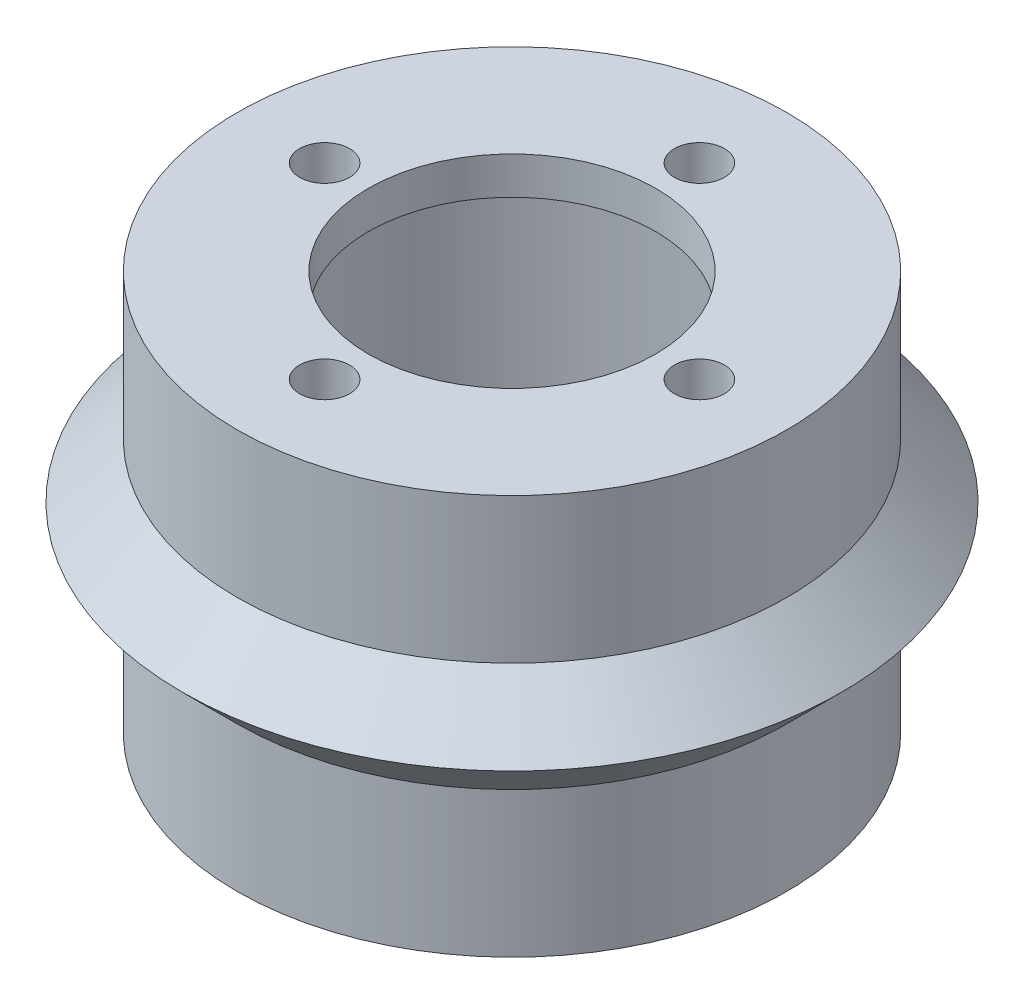
ISO-10303-21;
HEADER;
FILE_DESCRIPTION(('STEP AP214'),'2;1');
FILE_NAME('part.step','',(''),(''),'','','');
FILE_SCHEMA(('AUTOMOTIVE_DESIGN { 1 0 10303 214 1 1 1 1 }'));
ENDSEC;
DATA;
#1=APPLICATION_CONTEXT('core data for automotive mechanical design processes');
#2=APPLICATION_PROTOCOL_DEFINITION('international standard','automotive_design',2000,#1);
#3=PRODUCT_CONTEXT('',#1,'mechanical');
#4=PRODUCT('Part','Part','',(#3));
#5=PRODUCT_RELATED_PRODUCT_CATEGORY('part','',(#4));
#6=PRODUCT_DEFINITION_FORMATION('','',#4);
#7=PRODUCT_DEFINITION_CONTEXT('part definition',#1,'design');
#8=PRODUCT_DEFINITION('design','',#6,#7);
#9=PRODUCT_DEFINITION_SHAPE('','',#8);
#10=(LENGTH_UNIT() NAMED_UNIT(*) SI_UNIT(.MILLI.,.METRE.));
#11=(NAMED_UNIT(*) PLANE_ANGLE_UNIT() SI_UNIT($,.RADIAN.));
#12=(NAMED_UNIT(*) SI_UNIT($,.STERADIAN.) SOLID_ANGLE_UNIT());
#13=UNCERTAINTY_MEASURE_WITH_UNIT(LENGTH_MEASURE(1.E-05),#10,'distance_accuracy_value','');
#14=(GEOMETRIC_REPRESENTATION_CONTEXT(3) GLOBAL_UNCERTAINTY_ASSIGNED_CONTEXT((#13)) GLOBAL_UNIT_ASSIGNED_CONTEXT((#10,
#11,#12)) REPRESENTATION_CONTEXT('',''));
#15=CARTESIAN_POINT('',(0.,0.,0.));
#16=DIRECTION('',(0.,0.,1.));
#17=DIRECTION('',(1.,0.,0.));
#18=AXIS2_PLACEMENT_3D('',#15,#16,#17);
#19=CARTESIAN_POINT('',(0.,-4.37867965644037,0.));
#20=DIRECTION('',(0.,1.,0.));
#21=DIRECTION('',(0.,0.,1.));
#22=AXIS2_PLACEMENT_3D('',#19,#20,#21);
#23=CONICAL_SURFACE('',#22,22.,0.785398163397441);
#24=CARTESIAN_POINT('',(0.,0.,0.));
#25=DIRECTION('',(0.,-1.,0.));
#26=DIRECTION('',(0.,0.,-1.));
#27=AXIS2_PLACEMENT_3D('',#24,#25,#26);
#28=CIRCLE('',#27,26.3786796564404);
#29=CARTESIAN_POINT('',(0.,0.,-26.3786796564404));
#30=VERTEX_POINT('',#29);
#31=EDGE_CURVE('E68',#30,#30,#28,.T.);
#32=ORIENTED_EDGE('',*,*,#31,.T.);
#33=EDGE_LOOP('',(#32));
#34=FACE_BOUND('',#33,.T.);
#35=CARTESIAN_POINT('',(0.,-4.37867965644037,0.));
#36=DIRECTION('',(0.,-1.,0.));
#37=DIRECTION('',(0.,0.,-1.));
#38=AXIS2_PLACEMENT_3D('',#35,#36,#37);
#39=CIRCLE('',#38,22.);
#40=CARTESIAN_POINT('',(0.,-4.37867965644037,-22.));
#41=VERTEX_POINT('',#40);
#42=EDGE_CURVE('E44',#41,#41,#39,.T.);
#43=ORIENTED_EDGE('',*,*,#42,.F.);
#44=EDGE_LOOP('',(#43));
#45=FACE_BOUND('',#44,.T.);
#46=ADVANCED_FACE('F37',(#34,#45),#23,.T.);
#47=CARTESIAN_POINT('',(0.,0.,0.));
#48=DIRECTION('',(0.,-1.,0.));
#49=DIRECTION('',(0.,0.,-1.));
#50=AXIS2_PLACEMENT_3D('',#47,#48,#49);
#51=CYLINDRICAL_SURFACE('',#50,22.);
#52=ORIENTED_EDGE('',*,*,#42,.T.);
#53=EDGE_LOOP('',(#52));
#54=FACE_BOUND('',#53,.T.);
#55=CARTESIAN_POINT('',(0.,-16.,0.));
#56=DIRECTION('',(0.,-1.,0.));
#57=DIRECTION('',(0.,0.,-1.));
#58=AXIS2_PLACEMENT_3D('',#55,#56,#57);
#59=CIRCLE('',#58,22.);
#60=CARTESIAN_POINT('',(0.,-16.,-22.));
#61=VERTEX_POINT('',#60);
#62=EDGE_CURVE('E49',#61,#61,#59,.T.);
#63=ORIENTED_EDGE('',*,*,#62,.F.);
#64=EDGE_LOOP('',(#63));
#65=FACE_BOUND('',#64,.T.);
#66=ADVANCED_FACE('F135',(#54,#65),#51,.T.);
#67=CARTESIAN_POINT('',(22.,-16.,0.));
#68=DIRECTION('',(0.,-1.,0.));
#69=DIRECTION('',(0.,0.,-1.));
#70=AXIS2_PLACEMENT_3D('',#67,#68,#69);
#71=PLANE('',#70);
#72=ORIENTED_EDGE('',*,*,#62,.T.);
#73=EDGE_LOOP('',(#72));
#74=FACE_BOUND('',#73,.T.);
#75=CARTESIAN_POINT('',(0.,-16.,0.));
#76=DIRECTION('',(0.,-1.,0.));
#77=DIRECTION('',(0.,0.,-1.));
#78=AXIS2_PLACEMENT_3D('',#75,#76,#77);
#79=CIRCLE('',#78,18.5);
#80=CARTESIAN_POINT('',(0.,-16.,-18.5));
#81=VERTEX_POINT('',#80);
#82=EDGE_CURVE('E54',#81,#81,#79,.T.);
#83=ORIENTED_EDGE('',*,*,#82,.F.);
#84=EDGE_LOOP('',(#83));
#85=FACE_BOUND('',#84,.T.);
#86=ADVANCED_FACE('F140',(#74,#85),#71,.T.);
#87=CARTESIAN_POINT('',(0.,0.,0.));
#88=DIRECTION('',(0.,-1.,0.));
#89=DIRECTION('',(0.,0.,-1.));
#90=AXIS2_PLACEMENT_3D('',#87,#88,#89);
#91=CYLINDRICAL_SURFACE('',#90,18.5);
#92=CARTESIAN_POINT('',(0.,13.,0.));
#93=DIRECTION('',(0.,-1.,0.));
#94=DIRECTION('',(0.,0.,-1.));
#95=AXIS2_PLACEMENT_3D('',#92,#93,#94);
#96=CIRCLE('',#95,18.5);
#97=CARTESIAN_POINT('',(0.,13.,-18.5));
#98=VERTEX_POINT('',#97);
#99=EDGE_CURVE('E10',#98,#98,#96,.T.);
#100=ORIENTED_EDGE('',*,*,#99,.F.);
#101=EDGE_LOOP('',(#100));
#102=FACE_BOUND('',#101,.T.);
#103=ORIENTED_EDGE('',*,*,#82,.T.);
#104=EDGE_LOOP('',(#103));
#105=FACE_BOUND('',#104,.T.);
#106=ADVANCED_FACE('F147',(#102,#105),#91,.F.);
#107=CARTESIAN_POINT('',(22.,16.,0.));
#108=DIRECTION('',(0.,1.,0.));
#109=DIRECTION('',(0.,0.,1.));
#110=AXIS2_PLACEMENT_3D('',#107,#108,#109);
#111=PLANE('',#110);
#112=CARTESIAN_POINT('',(0.,16.,0.));
#113=DIRECTION('',(0.,-1.,0.));
#114=DIRECTION('',(0.,0.,-1.));
#115=AXIS2_PLACEMENT_3D('',#112,#113,#114);
#116=CIRCLE('',#115,22.);
#117=CARTESIAN_POINT('',(0.,16.,-22.));
#118=VERTEX_POINT('',#117);
#119=EDGE_CURVE('E60',#118,#118,#116,.T.);
#120=ORIENTED_EDGE('',*,*,#119,.F.);
#121=EDGE_LOOP('',(#120));
#122=FACE_BOUND('',#121,.T.);
#123=CARTESIAN_POINT('',(15.,16.,0.));
#124=DIRECTION('',(0.,-1.,0.));
#125=DIRECTION('',(0.,0.,-1.));
#126=AXIS2_PLACEMENT_3D('',#123,#124,#125);
#127=CIRCLE('',#126,2.);
#128=CARTESIAN_POINT('',(15.,16.,-2.));
#129=VERTEX_POINT('',#128);
#130=EDGE_CURVE('E73',#129,#129,#127,.T.);
#131=ORIENTED_EDGE('',*,*,#130,.T.);
#132=EDGE_LOOP('',(#131));
#133=FACE_BOUND('',#132,.T.);
#134=CARTESIAN_POINT('',(0.,16.,0.));
#135=DIRECTION('',(0.,-1.,0.));
#136=DIRECTION('',(0.,0.,-1.));
#137=AXIS2_PLACEMENT_3D('',#134,#135,#136);
#138=CIRCLE('',#137,11.4969351916493);
#139=CARTESIAN_POINT('',(0.,16.,-11.4969351916493));
#140=VERTEX_POINT('',#139);
#141=EDGE_CURVE('E81',#140,#140,#138,.T.);
#142=ORIENTED_EDGE('',*,*,#141,.T.);
#143=EDGE_LOOP('',(#142));
#144=FACE_BOUND('',#143,.T.);
#145=CARTESIAN_POINT('',(0.,16.,-15.));
#146=DIRECTION('',(0.,-1.,0.));
#147=DIRECTION('',(0.,0.,-1.));
#148=AXIS2_PLACEMENT_3D('',#145,#146,#147);
#149=CIRCLE('',#148,2.);
#150=CARTESIAN_POINT('',(0.,16.,-17.));
#151=VERTEX_POINT('',#150);
#152=EDGE_CURVE('E89',#151,#151,#149,.T.);
#153=ORIENTED_EDGE('',*,*,#152,.T.);
#154=EDGE_LOOP('',(#153));
#155=FACE_BOUND('',#154,.T.);
#156=CARTESIAN_POINT('',(-15.,16.,1.04744440165294E-13));
#157=DIRECTION('',(0.,-1.,0.));
#158=DIRECTION('',(0.,0.,-1.));
#159=AXIS2_PLACEMENT_3D('',#156,#157,#158);
#160=CIRCLE('',#159,2.);
#161=CARTESIAN_POINT('',(-15.,16.,-1.99999999999989));
#162=VERTEX_POINT('',#161);
#163=EDGE_CURVE('E97',#162,#162,#160,.T.);
#164=ORIENTED_EDGE('',*,*,#163,.T.);
#165=EDGE_LOOP('',(#164));
#166=FACE_BOUND('',#165,.T.);
#167=CARTESIAN_POINT('',(1.57116660247941E-13,16.,15.));
#168=DIRECTION('',(0.,-1.,0.));
#169=DIRECTION('',(0.,0.,-1.));
#170=AXIS2_PLACEMENT_3D('',#167,#168,#169);
#171=CIRCLE('',#170,2.);
#172=CARTESIAN_POINT('',(1.57116660247941E-13,16.,13.));
#173=VERTEX_POINT('',#172);
#174=EDGE_CURVE('E105',#173,#173,#171,.T.);
#175=ORIENTED_EDGE('',*,*,#174,.T.);
#176=EDGE_LOOP('',(#175));
#177=FACE_BOUND('',#176,.T.);
#178=ADVANCED_FACE('F154',(#122,#133,#144,#155,#166,#177),#111,.T.);
#179=CARTESIAN_POINT('',(0.,0.,0.));
#180=DIRECTION('',(0.,-1.,0.));
#181=DIRECTION('',(0.,0.,-1.));
#182=AXIS2_PLACEMENT_3D('',#179,#180,#181);
#183=CYLINDRICAL_SURFACE('',#182,22.);
#184=ORIENTED_EDGE('',*,*,#119,.T.);
#185=EDGE_LOOP('',(#184));
#186=FACE_BOUND('',#185,.T.);
#187=CARTESIAN_POINT('',(0.,4.37867965644037,0.));
#188=DIRECTION('',(0.,-1.,0.));
#189=DIRECTION('',(0.,0.,-1.));
#190=AXIS2_PLACEMENT_3D('',#187,#188,#189);
#191=CIRCLE('',#190,22.);
#192=CARTESIAN_POINT('',(0.,4.37867965644037,-22.));
#193=VERTEX_POINT('',#192);
#194=EDGE_CURVE('E64',#193,#193,#191,.T.);
#195=ORIENTED_EDGE('',*,*,#194,.F.);
#196=EDGE_LOOP('',(#195));
#197=FACE_BOUND('',#196,.T.);
#198=ADVANCED_FACE('F129',(#186,#197),#183,.T.);
#199=CARTESIAN_POINT('',(0.,0.,0.));
#200=DIRECTION('',(0.,-1.,0.));
#201=DIRECTION('',(0.,0.,-1.));
#202=AXIS2_PLACEMENT_3D('',#199,#200,#201);
#203=CONICAL_SURFACE('',#202,26.3786796564404,0.78539816339745);
#204=ORIENTED_EDGE('',*,*,#194,.T.);
#205=EDGE_LOOP('',(#204));
#206=FACE_BOUND('',#205,.T.);
#207=ORIENTED_EDGE('',*,*,#31,.F.);
#208=EDGE_LOOP('',(#207));
#209=FACE_BOUND('',#208,.T.);
#210=ADVANCED_FACE('F119',(#206,#209),#203,.T.);
#211=CARTESIAN_POINT('',(0.,13.,0.));
#212=DIRECTION('',(0.,-1.,0.));
#213=DIRECTION('',(0.,0.,-1.));
#214=AXIS2_PLACEMENT_3D('',#211,#212,#213);
#215=PLANE('',#214);
#216=CARTESIAN_POINT('',(-15.,13.,1.04744440165294E-13));
#217=DIRECTION('',(0.,-1.,0.));
#218=DIRECTION('',(0.,0.,-1.));
#219=AXIS2_PLACEMENT_3D('',#216,#217,#218);
#220=CIRCLE('',#219,2.);
#221=CARTESIAN_POINT('',(-15.,13.,-1.99999999999989));
#222=VERTEX_POINT('',#221);
#223=EDGE_CURVE('E93',#222,#222,#220,.T.);
#224=ORIENTED_EDGE('',*,*,#223,.F.);
#225=EDGE_LOOP('',(#224));
#226=FACE_BOUND('',#225,.T.);
#227=CARTESIAN_POINT('',(0.,13.,0.));
#228=DIRECTION('',(0.,-1.,0.));
#229=DIRECTION('',(0.,0.,-1.));
#230=AXIS2_PLACEMENT_3D('',#227,#228,#229);
#231=CIRCLE('',#230,11.4969351916493);
#232=CARTESIAN_POINT('',(0.,13.,-11.4969351916493));
#233=VERTEX_POINT('',#232);
#234=EDGE_CURVE('E77',#233,#233,#231,.T.);
#235=ORIENTED_EDGE('',*,*,#234,.F.);
#236=EDGE_LOOP('',(#235));
#237=FACE_BOUND('',#236,.T.);
#238=ORIENTED_EDGE('',*,*,#99,.T.);
#239=EDGE_LOOP('',(#238));
#240=FACE_BOUND('',#239,.T.);
#241=CARTESIAN_POINT('',(15.,13.,0.));
#242=DIRECTION('',(0.,-1.,0.));
#243=DIRECTION('',(0.,0.,-1.));
#244=AXIS2_PLACEMENT_3D('',#241,#242,#243);
#245=CIRCLE('',#244,2.);
#246=CARTESIAN_POINT('',(15.,13.,-2.));
#247=VERTEX_POINT('',#246);
#248=EDGE_CURVE('E72',#247,#247,#245,.T.);
#249=ORIENTED_EDGE('',*,*,#248,.F.);
#250=EDGE_LOOP('',(#249));
#251=FACE_BOUND('',#250,.T.);
#252=CARTESIAN_POINT('',(0.,13.,-15.));
#253=DIRECTION('',(0.,-1.,0.));
#254=DIRECTION('',(0.,0.,-1.));
#255=AXIS2_PLACEMENT_3D('',#252,#253,#254);
#256=CIRCLE('',#255,2.);
#257=CARTESIAN_POINT('',(0.,13.,-17.));
#258=VERTEX_POINT('',#257);
#259=EDGE_CURVE('E85',#258,#258,#256,.T.);
#260=ORIENTED_EDGE('',*,*,#259,.F.);
#261=EDGE_LOOP('',(#260));
#262=FACE_BOUND('',#261,.T.);
#263=CARTESIAN_POINT('',(1.57116660247941E-13,13.,15.));
#264=DIRECTION('',(0.,-1.,0.));
#265=DIRECTION('',(0.,0.,-1.));
#266=AXIS2_PLACEMENT_3D('',#263,#264,#265);
#267=CIRCLE('',#266,2.);
#268=CARTESIAN_POINT('',(1.57116660247941E-13,13.,13.));
#269=VERTEX_POINT('',#268);
#270=EDGE_CURVE('E101',#269,#269,#267,.T.);
#271=ORIENTED_EDGE('',*,*,#270,.F.);
#272=EDGE_LOOP('',(#271));
#273=FACE_BOUND('',#272,.T.);
#274=ADVANCED_FACE('F116',(#226,#237,#240,#251,#262,#273),#215,.T.);
#275=CARTESIAN_POINT('',(15.,13.,0.));
#276=DIRECTION('',(0.,1.,0.));
#277=DIRECTION('',(0.,0.,1.));
#278=AXIS2_PLACEMENT_3D('',#275,#276,#277);
#279=CYLINDRICAL_SURFACE('',#278,2.);
#280=ORIENTED_EDGE('',*,*,#248,.T.);
#281=EDGE_LOOP('',(#280));
#282=FACE_BOUND('',#281,.T.);
#283=ORIENTED_EDGE('',*,*,#130,.F.);
#284=EDGE_LOOP('',(#283));
#285=FACE_BOUND('',#284,.T.);
#286=ADVANCED_FACE('F118',(#282,#285),#279,.F.);
#287=CARTESIAN_POINT('',(0.,13.,0.));
#288=DIRECTION('',(0.,1.,0.));
#289=DIRECTION('',(0.,0.,1.));
#290=AXIS2_PLACEMENT_3D('',#287,#288,#289);
#291=CYLINDRICAL_SURFACE('',#290,11.4969351916493);
#292=ORIENTED_EDGE('',*,*,#234,.T.);
#293=EDGE_LOOP('',(#292));
#294=FACE_BOUND('',#293,.T.);
#295=ORIENTED_EDGE('',*,*,#141,.F.);
#296=EDGE_LOOP('',(#295));
#297=FACE_BOUND('',#296,.T.);
#298=ADVANCED_FACE('F126',(#294,#297),#291,.F.);
#299=CARTESIAN_POINT('',(0.,13.,-15.));
#300=DIRECTION('',(0.,1.,0.));
#301=DIRECTION('',(0.,0.,1.));
#302=AXIS2_PLACEMENT_3D('',#299,#300,#301);
#303=CYLINDRICAL_SURFACE('',#302,2.);
#304=ORIENTED_EDGE('',*,*,#259,.T.);
#305=EDGE_LOOP('',(#304));
#306=FACE_BOUND('',#305,.T.);
#307=ORIENTED_EDGE('',*,*,#152,.F.);
#308=EDGE_LOOP('',(#307));
#309=FACE_BOUND('',#308,.T.);
#310=ADVANCED_FACE('F182',(#306,#309),#303,.F.);
#311=CARTESIAN_POINT('',(-15.,13.,1.04744440165294E-13));
#312=DIRECTION('',(0.,1.,0.));
#313=DIRECTION('',(0.,0.,1.));
#314=AXIS2_PLACEMENT_3D('',#311,#312,#313);
#315=CYLINDRICAL_SURFACE('',#314,2.);
#316=ORIENTED_EDGE('',*,*,#223,.T.);
#317=EDGE_LOOP('',(#316));
#318=FACE_BOUND('',#317,.T.);
#319=ORIENTED_EDGE('',*,*,#163,.F.);
#320=EDGE_LOOP('',(#319));
#321=FACE_BOUND('',#320,.T.);
#322=ADVANCED_FACE('F177',(#318,#321),#315,.F.);
#323=CARTESIAN_POINT('',(1.57116660247941E-13,13.,15.));
#324=DIRECTION('',(0.,1.,0.));
#325=DIRECTION('',(0.,0.,1.));
#326=AXIS2_PLACEMENT_3D('',#323,#324,#325);
#327=CYLINDRICAL_SURFACE('',#326,2.);
#328=ORIENTED_EDGE('',*,*,#270,.T.);
#329=EDGE_LOOP('',(#328));
#330=FACE_BOUND('',#329,.T.);
#331=ORIENTED_EDGE('',*,*,#174,.F.);
#332=EDGE_LOOP('',(#331));
#333=FACE_BOUND('',#332,.T.);
#334=ADVANCED_FACE('F113',(#330,#333),#327,.F.);
#335=CLOSED_SHELL('',(#46,#66,#86,#106,#178,#198,#210,#274,#286,#298,#310,#322,#334));
#336=MANIFOLD_SOLID_BREP('B2',#335);
#337=ADVANCED_BREP_SHAPE_REPRESENTATION('',(#18,#336),#14);
#338=SHAPE_DEFINITION_REPRESENTATION(#9,#337);
ENDSEC;
END-ISO-10303-21;
